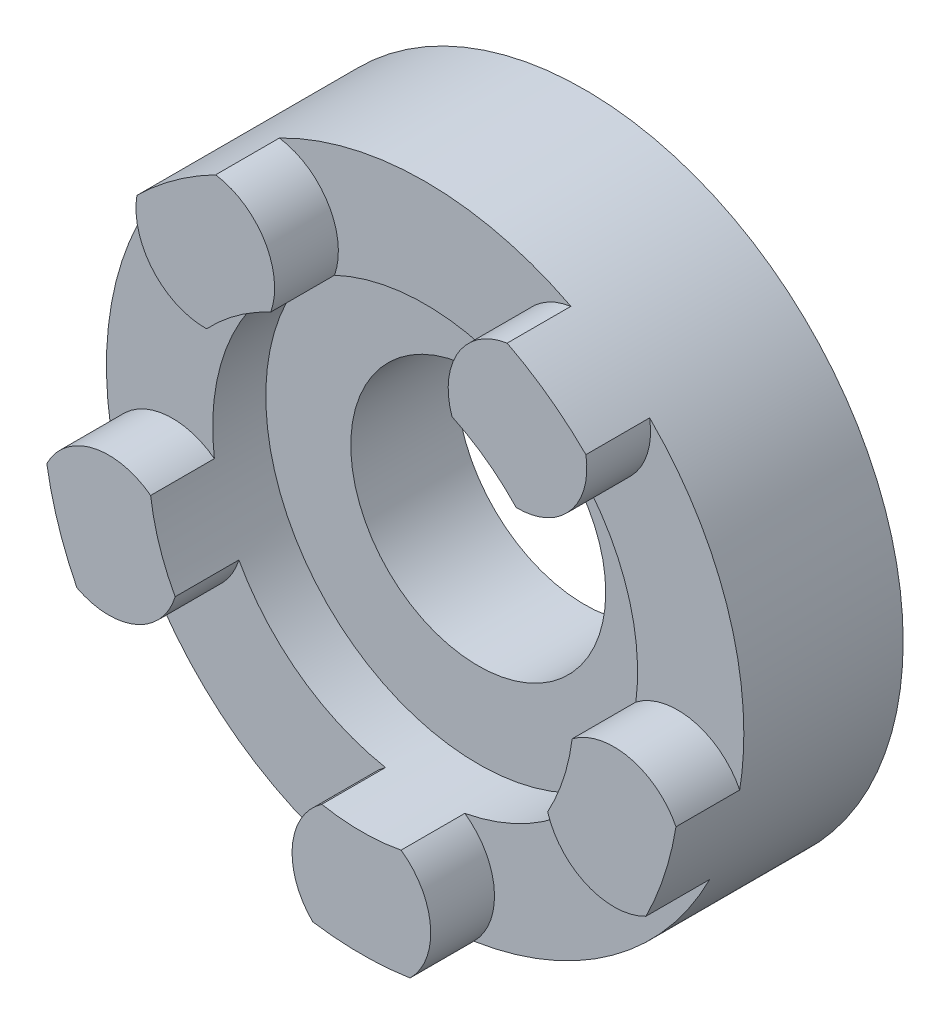
ISO-10303-21;
HEADER;
FILE_DESCRIPTION(('STEP AP214'),'2;1');
FILE_NAME('part.step','',(''),(''),'','','');
FILE_SCHEMA(('AUTOMOTIVE_DESIGN { 1 0 10303 214 1 1 1 1 }'));
ENDSEC;
DATA;
#1=APPLICATION_CONTEXT('core data for automotive mechanical design processes');
#2=APPLICATION_PROTOCOL_DEFINITION('international standard','automotive_design',2000,#1);
#3=PRODUCT_CONTEXT('',#1,'mechanical');
#4=PRODUCT('Part','Part','',(#3));
#5=PRODUCT_RELATED_PRODUCT_CATEGORY('part','',(#4));
#6=PRODUCT_DEFINITION_FORMATION('','',#4);
#7=PRODUCT_DEFINITION_CONTEXT('part definition',#1,'design');
#8=PRODUCT_DEFINITION('design','',#6,#7);
#9=PRODUCT_DEFINITION_SHAPE('','',#8);
#10=(LENGTH_UNIT() NAMED_UNIT(*) SI_UNIT(.MILLI.,.METRE.));
#11=(NAMED_UNIT(*) PLANE_ANGLE_UNIT() SI_UNIT($,.RADIAN.));
#12=(NAMED_UNIT(*) SI_UNIT($,.STERADIAN.) SOLID_ANGLE_UNIT());
#13=UNCERTAINTY_MEASURE_WITH_UNIT(LENGTH_MEASURE(1.E-05),#10,'distance_accuracy_value','');
#14=(GEOMETRIC_REPRESENTATION_CONTEXT(3) GLOBAL_UNCERTAINTY_ASSIGNED_CONTEXT((#13)) GLOBAL_UNIT_ASSIGNED_CONTEXT((#10,
#11,#12)) REPRESENTATION_CONTEXT('',''));
#15=CARTESIAN_POINT('',(0.,0.,0.));
#16=DIRECTION('',(0.,0.,1.));
#17=DIRECTION('',(1.,0.,0.));
#18=AXIS2_PLACEMENT_3D('',#15,#16,#17);
#19=CARTESIAN_POINT('',(0.,0.,2.5));
#20=DIRECTION('',(0.,0.,1.));
#21=DIRECTION('',(1.,0.,0.));
#22=AXIS2_PLACEMENT_3D('',#19,#20,#21);
#23=PLANE('',#22);
#24=CARTESIAN_POINT('',(0.,0.,2.5));
#25=DIRECTION('',(0.,0.,1.));
#26=DIRECTION('',(1.,0.,0.));
#27=AXIS2_PLACEMENT_3D('',#24,#25,#26);
#28=CIRCLE('',#27,15.);
#29=CARTESIAN_POINT('',(2.29060358245761,-14.8240728286133,2.5));
#30=VERTEX_POINT('',#29);
#31=CARTESIAN_POINT('',(13.3906956273311,-6.7593838932388,2.5));
#32=VERTEX_POINT('',#31);
#33=EDGE_CURVE('E312',#30,#32,#28,.T.);
#34=ORIENTED_EDGE('',*,*,#33,.T.);
#35=CARTESIAN_POINT('',(11.8882064536894,-3.86271242968698,2.5));
#36=DIRECTION('',(0.,0.,1.));
#37=DIRECTION('',(1.,0.,0.));
#38=AXIS2_PLACEMENT_3D('',#35,#36,#37);
#39=CIRCLE('',#38,3.26315480550128);
#40=CARTESIAN_POINT('',(8.76615619788801,-4.81191287475464,2.5));
#41=VERTEX_POINT('',#40);
#42=EDGE_CURVE('E188',#41,#32,#39,.T.);
#43=ORIENTED_EDGE('',*,*,#42,.F.);
#44=CARTESIAN_POINT('',(0.,0.,2.5));
#45=DIRECTION('',(0.,0.,1.));
#46=DIRECTION('',(1.,0.,0.));
#47=AXIS2_PLACEMENT_3D('',#44,#45,#46);
#48=CIRCLE('',#47,10.);
#49=CARTESIAN_POINT('',(1.86750985488725,-9.82407282861336,2.5));
#50=VERTEX_POINT('',#49);
#51=EDGE_CURVE('E304',#50,#41,#48,.T.);
#52=ORIENTED_EDGE('',*,*,#51,.F.);
#53=CARTESIAN_POINT('',(0.,-12.5,2.5));
#54=DIRECTION('',(0.,0.,1.));
#55=DIRECTION('',(1.,0.,0.));
#56=AXIS2_PLACEMENT_3D('',#53,#54,#55);
#57=CIRCLE('',#56,3.26315480550132);
#58=EDGE_CURVE('E281',#30,#50,#57,.T.);
#59=ORIENTED_EDGE('',*,*,#58,.F.);
#60=EDGE_LOOP('',(#34,#43,#52,#59));
#61=FACE_BOUND('',#60,.T.);
#62=ADVANCED_FACE('F35',(#61),#23,.T.);
#63=CARTESIAN_POINT('',(9.92034076253372,-1.25969804128286,2.5));
#64=VERTEX_POINT('',#63);
#65=CARTESIAN_POINT('',(7.28529233587261,6.85014712111175,2.5));
#66=VERTEX_POINT('',#65);
#67=EDGE_CURVE('E308',#64,#66,#48,.T.);
#68=ORIENTED_EDGE('',*,*,#67,.F.);
#69=CARTESIAN_POINT('',(11.8882064536894,-3.86271242968698,2.5));
#70=DIRECTION('',(0.,0.,1.));
#71=DIRECTION('',(1.,0.,0.));
#72=AXIS2_PLACEMENT_3D('',#69,#70,#71);
#73=CIRCLE('',#72,3.26315480550132);
#74=CARTESIAN_POINT('',(14.8063664960422,-2.40239696654825,2.5));
#75=VERTEX_POINT('',#74);
#76=EDGE_CURVE('E182',#75,#64,#73,.T.);
#77=ORIENTED_EDGE('',*,*,#76,.F.);
#78=CARTESIAN_POINT('',(10.5665086131529,10.6465438395832,2.5));
#79=VERTEX_POINT('',#78);
#80=EDGE_CURVE('E314',#75,#79,#28,.T.);
#81=ORIENTED_EDGE('',*,*,#80,.T.);
#82=CARTESIAN_POINT('',(7.347315653656,10.1127124296868,2.5));
#83=DIRECTION('',(0.,0.,1.));
#84=DIRECTION('',(1.,0.,0.));
#85=AXIS2_PLACEMENT_3D('',#82,#83,#84);
#86=CIRCLE('',#85,3.26315480550129);
#87=EDGE_CURVE('E192',#66,#79,#86,.T.);
#88=ORIENTED_EDGE('',*,*,#87,.F.);
#89=EDGE_LOOP('',(#68,#77,#81,#88));
#90=FACE_BOUND('',#89,.T.);
#91=ADVANCED_FACE('F346',(#90),#23,.T.);
#92=CARTESIAN_POINT('',(4.26359791633974,9.0455366235389,2.5));
#93=VERTEX_POINT('',#92);
#94=CARTESIAN_POINT('',(-4.26359791633966,9.04553662353894,2.5));
#95=VERTEX_POINT('',#94);
#96=EDGE_CURVE('E366',#93,#95,#48,.T.);
#97=ORIENTED_EDGE('',*,*,#96,.F.);
#98=CARTESIAN_POINT('',(7.347315653656,10.1127124296868,2.5));
#99=DIRECTION('',(0.,0.,1.));
#100=DIRECTION('',(1.,0.,0.));
#101=AXIS2_PLACEMENT_3D('',#98,#99,#100);
#102=CIRCLE('',#101,3.26315480550131);
#103=CARTESIAN_POINT('',(6.86023416198428,13.3393098488169,2.5));
#104=VERTEX_POINT('',#103);
#105=EDGE_CURVE('E211',#104,#93,#102,.T.);
#106=ORIENTED_EDGE('',*,*,#105,.F.);
#107=CARTESIAN_POINT('',(-6.86023416198416,13.339309848817,2.5));
#108=VERTEX_POINT('',#107);
#109=EDGE_CURVE('E379',#104,#108,#28,.T.);
#110=ORIENTED_EDGE('',*,*,#109,.T.);
#111=CARTESIAN_POINT('',(-7.34731565365586,10.1127124296869,2.5));
#112=DIRECTION('',(0.,0.,1.));
#113=DIRECTION('',(1.,0.,0.));
#114=AXIS2_PLACEMENT_3D('',#111,#112,#113);
#115=CIRCLE('',#114,3.26315480550129);
#116=EDGE_CURVE('E229',#95,#108,#115,.T.);
#117=ORIENTED_EDGE('',*,*,#116,.F.);
#118=EDGE_LOOP('',(#97,#106,#110,#117));
#119=FACE_BOUND('',#118,.T.);
#120=ADVANCED_FACE('F351',(#119),#23,.T.);
#121=CARTESIAN_POINT('',(-7.28529233587255,6.85014712111183,2.5));
#122=VERTEX_POINT('',#121);
#123=CARTESIAN_POINT('',(-9.92034076253373,-1.25969804128281,2.5));
#124=VERTEX_POINT('',#123);
#125=EDGE_CURVE('E365',#122,#124,#48,.T.);
#126=ORIENTED_EDGE('',*,*,#125,.F.);
#127=CARTESIAN_POINT('',(-7.34731565365586,10.1127124296869,2.5));
#128=DIRECTION('',(0.,0.,1.));
#129=DIRECTION('',(1.,0.,0.));
#130=AXIS2_PLACEMENT_3D('',#127,#128,#129);
#131=CIRCLE('',#130,3.26315480550131);
#132=CARTESIAN_POINT('',(-10.5665086131528,10.6465438395833,2.5));
#133=VERTEX_POINT('',#132);
#134=EDGE_CURVE('E233',#133,#122,#131,.T.);
#135=ORIENTED_EDGE('',*,*,#134,.F.);
#136=CARTESIAN_POINT('',(-14.8063664960422,-2.40239696654818,2.5));
#137=VERTEX_POINT('',#136);
#138=EDGE_CURVE('E380',#133,#137,#28,.T.);
#139=ORIENTED_EDGE('',*,*,#138,.T.);
#140=CARTESIAN_POINT('',(-11.8882064536894,-3.86271242968685,2.5));
#141=DIRECTION('',(0.,0.,1.));
#142=DIRECTION('',(1.,0.,0.));
#143=AXIS2_PLACEMENT_3D('',#140,#141,#142);
#144=CIRCLE('',#143,3.26315480550128);
#145=EDGE_CURVE('E253',#124,#137,#144,.T.);
#146=ORIENTED_EDGE('',*,*,#145,.F.);
#147=EDGE_LOOP('',(#126,#135,#139,#146));
#148=FACE_BOUND('',#147,.T.);
#149=ADVANCED_FACE('F354',(#148),#23,.T.);
#150=CARTESIAN_POINT('',(-8.76615619788804,-4.81191287475461,2.5));
#151=VERTEX_POINT('',#150);
#152=CARTESIAN_POINT('',(-1.86750985488717,-9.82407282861336,2.5));
#153=VERTEX_POINT('',#152);
#154=EDGE_CURVE('E309',#151,#153,#48,.T.);
#155=ORIENTED_EDGE('',*,*,#154,.F.);
#156=CARTESIAN_POINT('',(-11.8882064536894,-3.86271242968685,2.5));
#157=DIRECTION('',(0.,0.,1.));
#158=DIRECTION('',(1.,0.,0.));
#159=AXIS2_PLACEMENT_3D('',#156,#157,#158);
#160=CIRCLE('',#159,3.26315480550132);
#161=CARTESIAN_POINT('',(-13.3906956273311,-6.75938389323874,2.5));
#162=VERTEX_POINT('',#161);
#163=EDGE_CURVE('E257',#162,#151,#160,.T.);
#164=ORIENTED_EDGE('',*,*,#163,.F.);
#165=CARTESIAN_POINT('',(-2.29060358245752,-14.8240728286134,2.5));
#166=VERTEX_POINT('',#165);
#167=EDGE_CURVE('E307',#162,#166,#28,.T.);
#168=ORIENTED_EDGE('',*,*,#167,.T.);
#169=CARTESIAN_POINT('',(0.,-12.5,2.5));
#170=DIRECTION('',(0.,0.,1.));
#171=DIRECTION('',(1.,0.,0.));
#172=AXIS2_PLACEMENT_3D('',#169,#170,#171);
#173=CIRCLE('',#172,3.26315480550128);
#174=EDGE_CURVE('E277',#153,#166,#173,.T.);
#175=ORIENTED_EDGE('',*,*,#174,.F.);
#176=EDGE_LOOP('',(#155,#164,#168,#175));
#177=FACE_BOUND('',#176,.T.);
#178=ADVANCED_FACE('F326',(#177),#23,.T.);
#179=CARTESIAN_POINT('',(0.,0.,0.));
#180=DIRECTION('',(0.,0.,1.));
#181=DIRECTION('',(1.,0.,0.));
#182=AXIS2_PLACEMENT_3D('',#179,#180,#181);
#183=PLANE('',#182);
#184=CARTESIAN_POINT('',(0.,0.,0.));
#185=DIRECTION('',(0.,0.,1.));
#186=DIRECTION('',(1.,0.,0.));
#187=AXIS2_PLACEMENT_3D('',#184,#185,#186);
#188=CIRCLE('',#187,6.);
#189=CARTESIAN_POINT('',(6.,0.,0.));
#190=VERTEX_POINT('',#189);
#191=EDGE_CURVE('E39',#190,#190,#188,.T.);
#192=ORIENTED_EDGE('',*,*,#191,.F.);
#193=EDGE_LOOP('',(#192));
#194=FACE_BOUND('',#193,.T.);
#195=CARTESIAN_POINT('',(0.,0.,0.));
#196=DIRECTION('',(0.,0.,1.));
#197=DIRECTION('',(1.,0.,0.));
#198=AXIS2_PLACEMENT_3D('',#195,#196,#197);
#199=CIRCLE('',#198,10.);
#200=CARTESIAN_POINT('',(10.,0.,0.));
#201=VERTEX_POINT('',#200);
#202=EDGE_CURVE('E303',#201,#201,#199,.T.);
#203=ORIENTED_EDGE('',*,*,#202,.T.);
#204=EDGE_LOOP('',(#203));
#205=FACE_BOUND('',#204,.T.);
#206=ADVANCED_FACE('F323',(#194,#205),#183,.T.);
#207=CARTESIAN_POINT('',(0.,0.,-5.));
#208=DIRECTION('',(0.,0.,1.));
#209=DIRECTION('',(1.,0.,0.));
#210=AXIS2_PLACEMENT_3D('',#207,#208,#209);
#211=CYLINDRICAL_SURFACE('',#210,15.);
#212=CARTESIAN_POINT('',(0.,0.,-5.));
#213=DIRECTION('',(0.,0.,1.));
#214=DIRECTION('',(1.,0.,0.));
#215=AXIS2_PLACEMENT_3D('',#212,#213,#214);
#216=CIRCLE('',#215,15.);
#217=CARTESIAN_POINT('',(15.,0.,-5.));
#218=VERTEX_POINT('',#217);
#219=EDGE_CURVE('E44',#218,#218,#216,.T.);
#220=ORIENTED_EDGE('',*,*,#219,.T.);
#221=EDGE_LOOP('',(#220));
#222=FACE_BOUND('',#221,.T.);
#223=ORIENTED_EDGE('',*,*,#33,.F.);
#224=DIRECTION('',(0.,0.,-1.));
#225=VECTOR('',#224,1.);
#226=CARTESIAN_POINT('',(2.29060358245762,-14.8240728286133,5.5));
#227=LINE('',#226,#225);
#228=CARTESIAN_POINT('',(2.29060358245762,-14.8240728286133,5.5));
#229=VERTEX_POINT('',#228);
#230=EDGE_CURVE('E297',#229,#30,#227,.T.);
#231=ORIENTED_EDGE('',*,*,#230,.F.);
#232=CARTESIAN_POINT('',(0.,0.,5.5));
#233=DIRECTION('',(0.,0.,1.));
#234=DIRECTION('',(1.,0.,0.));
#235=AXIS2_PLACEMENT_3D('',#232,#233,#234);
#236=CIRCLE('',#235,15.);
#237=CARTESIAN_POINT('',(-2.29060358245749,-14.8240728286134,5.5));
#238=VERTEX_POINT('',#237);
#239=EDGE_CURVE('E280',#238,#229,#236,.T.);
#240=ORIENTED_EDGE('',*,*,#239,.F.);
#241=DIRECTION('',(0.,0.,-1.));
#242=VECTOR('',#241,1.);
#243=CARTESIAN_POINT('',(-2.29060358245749,-14.8240728286134,5.5));
#244=LINE('',#243,#242);
#245=EDGE_CURVE('E300',#238,#166,#244,.T.);
#246=ORIENTED_EDGE('',*,*,#245,.T.);
#247=ORIENTED_EDGE('',*,*,#167,.F.);
#248=DIRECTION('',(0.,0.,-1.));
#249=VECTOR('',#248,1.);
#250=CARTESIAN_POINT('',(-13.3906956273311,-6.75938389323874,5.5));
#251=LINE('',#250,#249);
#252=CARTESIAN_POINT('',(-13.3906956273311,-6.75938389323874,5.5));
#253=VERTEX_POINT('',#252);
#254=EDGE_CURVE('E272',#253,#162,#251,.T.);
#255=ORIENTED_EDGE('',*,*,#254,.F.);
#256=CARTESIAN_POINT('',(0.,0.,5.5));
#257=DIRECTION('',(0.,0.,1.));
#258=DIRECTION('',(1.,0.,0.));
#259=AXIS2_PLACEMENT_3D('',#256,#257,#258);
#260=CIRCLE('',#259,15.);
#261=CARTESIAN_POINT('',(-14.8063664960422,-2.40239696654818,5.5));
#262=VERTEX_POINT('',#261);
#263=EDGE_CURVE('E256',#262,#253,#260,.T.);
#264=ORIENTED_EDGE('',*,*,#263,.F.);
#265=DIRECTION('',(0.,0.,-1.));
#266=VECTOR('',#265,1.);
#267=CARTESIAN_POINT('',(-14.8063664960422,-2.40239696654818,5.5));
#268=LINE('',#267,#266);
#269=EDGE_CURVE('E274',#262,#137,#268,.T.);
#270=ORIENTED_EDGE('',*,*,#269,.T.);
#271=ORIENTED_EDGE('',*,*,#138,.F.);
#272=DIRECTION('',(0.,0.,-1.));
#273=VECTOR('',#272,1.);
#274=CARTESIAN_POINT('',(-10.5665086131528,10.6465438395833,5.5));
#275=LINE('',#274,#273);
#276=CARTESIAN_POINT('',(-10.5665086131528,10.6465438395833,5.5));
#277=VERTEX_POINT('',#276);
#278=EDGE_CURVE('E248',#277,#133,#275,.T.);
#279=ORIENTED_EDGE('',*,*,#278,.F.);
#280=CARTESIAN_POINT('',(0.,0.,5.5));
#281=DIRECTION('',(0.,0.,1.));
#282=DIRECTION('',(1.,0.,0.));
#283=AXIS2_PLACEMENT_3D('',#280,#281,#282);
#284=CIRCLE('',#283,15.);
#285=CARTESIAN_POINT('',(-6.86023416198416,13.339309848817,5.5));
#286=VERTEX_POINT('',#285);
#287=EDGE_CURVE('E232',#286,#277,#284,.T.);
#288=ORIENTED_EDGE('',*,*,#287,.F.);
#289=DIRECTION('',(0.,0.,-1.));
#290=VECTOR('',#289,1.);
#291=CARTESIAN_POINT('',(-6.86023416198416,13.339309848817,5.5));
#292=LINE('',#291,#290);
#293=EDGE_CURVE('E250',#286,#108,#292,.T.);
#294=ORIENTED_EDGE('',*,*,#293,.T.);
#295=ORIENTED_EDGE('',*,*,#109,.F.);
#296=DIRECTION('',(0.,0.,-1.));
#297=VECTOR('',#296,1.);
#298=CARTESIAN_POINT('',(6.86023416198428,13.3393098488169,5.5));
#299=LINE('',#298,#297);
#300=CARTESIAN_POINT('',(6.86023416198428,13.3393098488169,5.5));
#301=VERTEX_POINT('',#300);
#302=EDGE_CURVE('E224',#301,#104,#299,.T.);
#303=ORIENTED_EDGE('',*,*,#302,.F.);
#304=CARTESIAN_POINT('',(0.,0.,5.5));
#305=DIRECTION('',(0.,0.,1.));
#306=DIRECTION('',(1.,0.,0.));
#307=AXIS2_PLACEMENT_3D('',#304,#305,#306);
#308=CIRCLE('',#307,15.);
#309=CARTESIAN_POINT('',(10.5665086131529,10.6465438395832,5.5));
#310=VERTEX_POINT('',#309);
#311=EDGE_CURVE('E210',#310,#301,#308,.T.);
#312=ORIENTED_EDGE('',*,*,#311,.F.);
#313=DIRECTION('',(0.,0.,-1.));
#314=VECTOR('',#313,1.);
#315=CARTESIAN_POINT('',(10.5665086131529,10.6465438395832,5.5));
#316=LINE('',#315,#314);
#317=EDGE_CURVE('E226',#310,#79,#316,.T.);
#318=ORIENTED_EDGE('',*,*,#317,.T.);
#319=ORIENTED_EDGE('',*,*,#80,.F.);
#320=DIRECTION('',(0.,0.,-1.));
#321=VECTOR('',#320,1.);
#322=CARTESIAN_POINT('',(14.8063664960422,-2.40239696654825,5.5));
#323=LINE('',#322,#321);
#324=CARTESIAN_POINT('',(14.8063664960422,-2.40239696654825,5.5));
#325=VERTEX_POINT('',#324);
#326=EDGE_CURVE('E193',#325,#75,#323,.T.);
#327=ORIENTED_EDGE('',*,*,#326,.F.);
#328=CARTESIAN_POINT('',(0.,0.,5.5));
#329=DIRECTION('',(0.,0.,1.));
#330=DIRECTION('',(1.,0.,0.));
#331=AXIS2_PLACEMENT_3D('',#328,#329,#330);
#332=CIRCLE('',#331,15.);
#333=CARTESIAN_POINT('',(13.3906956273311,-6.7593838932388,5.5));
#334=VERTEX_POINT('',#333);
#335=EDGE_CURVE('E177',#334,#325,#332,.T.);
#336=ORIENTED_EDGE('',*,*,#335,.F.);
#337=DIRECTION('',(0.,0.,-1.));
#338=VECTOR('',#337,1.);
#339=CARTESIAN_POINT('',(13.3906956273311,-6.7593838932388,5.5));
#340=LINE('',#339,#338);
#341=EDGE_CURVE('E185',#334,#32,#340,.T.);
#342=ORIENTED_EDGE('',*,*,#341,.T.);
#343=EDGE_LOOP('',(#223,#231,#240,#246,#247,#255,#264,#270,#271,#279,#288,#294,#295,#303,#312,
#318,#319,#327,#336,#342));
#344=FACE_BOUND('',#343,.T.);
#345=ADVANCED_FACE('F37',(#222,#344),#211,.T.);
#346=CARTESIAN_POINT('',(0.,0.,-5.));
#347=DIRECTION('',(0.,0.,1.));
#348=DIRECTION('',(1.,0.,0.));
#349=AXIS2_PLACEMENT_3D('',#346,#347,#348);
#350=CYLINDRICAL_SURFACE('',#349,6.);
#351=CARTESIAN_POINT('',(0.,0.,-5.));
#352=DIRECTION('',(0.,0.,1.));
#353=DIRECTION('',(1.,0.,0.));
#354=AXIS2_PLACEMENT_3D('',#351,#352,#353);
#355=CIRCLE('',#354,6.);
#356=CARTESIAN_POINT('',(6.,0.,-5.));
#357=VERTEX_POINT('',#356);
#358=EDGE_CURVE('E11',#357,#357,#355,.T.);
#359=ORIENTED_EDGE('',*,*,#358,.F.);
#360=EDGE_LOOP('',(#359));
#361=FACE_BOUND('',#360,.T.);
#362=ORIENTED_EDGE('',*,*,#191,.T.);
#363=EDGE_LOOP('',(#362));
#364=FACE_BOUND('',#363,.T.);
#365=ADVANCED_FACE('F321',(#361,#364),#350,.F.);
#366=CARTESIAN_POINT('',(0.,0.,-5.));
#367=DIRECTION('',(0.,0.,1.));
#368=DIRECTION('',(1.,0.,0.));
#369=AXIS2_PLACEMENT_3D('',#366,#367,#368);
#370=PLANE('',#369);
#371=ORIENTED_EDGE('',*,*,#219,.F.);
#372=EDGE_LOOP('',(#371));
#373=FACE_BOUND('',#372,.T.);
#374=ORIENTED_EDGE('',*,*,#358,.T.);
#375=EDGE_LOOP('',(#374));
#376=FACE_BOUND('',#375,.T.);
#377=ADVANCED_FACE('F333',(#373,#376),#370,.F.);
#378=CARTESIAN_POINT('',(0.,0.,2.5));
#379=DIRECTION('',(0.,0.,-1.));
#380=DIRECTION('',(-1.,0.,0.));
#381=AXIS2_PLACEMENT_3D('',#378,#379,#380);
#382=CYLINDRICAL_SURFACE('',#381,10.);
#383=ORIENTED_EDGE('',*,*,#51,.T.);
#384=DIRECTION('',(0.,0.,-1.));
#385=VECTOR('',#384,1.);
#386=CARTESIAN_POINT('',(8.76615619788801,-4.81191287475464,5.5));
#387=LINE('',#386,#385);
#388=CARTESIAN_POINT('',(8.76615619788801,-4.81191287475464,5.5));
#389=VERTEX_POINT('',#388);
#390=EDGE_CURVE('E202',#389,#41,#387,.T.);
#391=ORIENTED_EDGE('',*,*,#390,.F.);
#392=CARTESIAN_POINT('',(0.,0.,5.5));
#393=DIRECTION('',(0.,0.,-1.));
#394=DIRECTION('',(1.,0.,0.));
#395=AXIS2_PLACEMENT_3D('',#392,#393,#394);
#396=CIRCLE('',#395,9.99999999999999);
#397=CARTESIAN_POINT('',(9.92034076253373,-1.25969804128286,5.5));
#398=VERTEX_POINT('',#397);
#399=EDGE_CURVE('E179',#398,#389,#396,.T.);
#400=ORIENTED_EDGE('',*,*,#399,.F.);
#401=DIRECTION('',(0.,0.,-1.));
#402=VECTOR('',#401,1.);
#403=CARTESIAN_POINT('',(9.92034076253373,-1.25969804128286,5.5));
#404=LINE('',#403,#402);
#405=EDGE_CURVE('E51',#398,#64,#404,.T.);
#406=ORIENTED_EDGE('',*,*,#405,.T.);
#407=ORIENTED_EDGE('',*,*,#67,.T.);
#408=DIRECTION('',(0.,0.,-1.));
#409=VECTOR('',#408,1.);
#410=CARTESIAN_POINT('',(7.28529233587261,6.85014712111175,5.5));
#411=LINE('',#410,#409);
#412=CARTESIAN_POINT('',(7.28529233587261,6.85014712111175,5.5));
#413=VERTEX_POINT('',#412);
#414=EDGE_CURVE('E217',#413,#66,#411,.T.);
#415=ORIENTED_EDGE('',*,*,#414,.F.);
#416=CARTESIAN_POINT('',(0.,0.,5.5));
#417=DIRECTION('',(0.,0.,-1.));
#418=DIRECTION('',(1.,0.,0.));
#419=AXIS2_PLACEMENT_3D('',#416,#417,#418);
#420=CIRCLE('',#419,9.99999999999999);
#421=CARTESIAN_POINT('',(4.26359791633974,9.0455366235389,5.5));
#422=VERTEX_POINT('',#421);
#423=EDGE_CURVE('E215',#422,#413,#420,.T.);
#424=ORIENTED_EDGE('',*,*,#423,.F.);
#425=DIRECTION('',(0.,0.,-1.));
#426=VECTOR('',#425,1.);
#427=CARTESIAN_POINT('',(4.26359791633974,9.0455366235389,5.5));
#428=LINE('',#427,#426);
#429=EDGE_CURVE('E58',#422,#93,#428,.T.);
#430=ORIENTED_EDGE('',*,*,#429,.T.);
#431=ORIENTED_EDGE('',*,*,#96,.T.);
#432=DIRECTION('',(0.,0.,-1.));
#433=VECTOR('',#432,1.);
#434=CARTESIAN_POINT('',(-4.26359791633966,9.04553662353894,5.5));
#435=LINE('',#434,#433);
#436=CARTESIAN_POINT('',(-4.26359791633966,9.04553662353894,5.5));
#437=VERTEX_POINT('',#436);
#438=EDGE_CURVE('E239',#437,#95,#435,.T.);
#439=ORIENTED_EDGE('',*,*,#438,.F.);
#440=CARTESIAN_POINT('',(0.,0.,5.5));
#441=DIRECTION('',(0.,0.,-1.));
#442=DIRECTION('',(1.,0.,0.));
#443=AXIS2_PLACEMENT_3D('',#440,#441,#442);
#444=CIRCLE('',#443,10.);
#445=CARTESIAN_POINT('',(-7.28529233587256,6.85014712111183,5.5));
#446=VERTEX_POINT('',#445);
#447=EDGE_CURVE('E237',#446,#437,#444,.T.);
#448=ORIENTED_EDGE('',*,*,#447,.F.);
#449=DIRECTION('',(0.,0.,-1.));
#450=VECTOR('',#449,1.);
#451=CARTESIAN_POINT('',(-7.28529233587256,6.85014712111183,5.5));
#452=LINE('',#451,#450);
#453=EDGE_CURVE('E246',#446,#122,#452,.T.);
#454=ORIENTED_EDGE('',*,*,#453,.T.);
#455=ORIENTED_EDGE('',*,*,#125,.T.);
#456=DIRECTION('',(0.,0.,-1.));
#457=VECTOR('',#456,1.);
#458=CARTESIAN_POINT('',(-9.92034076253373,-1.25969804128281,5.5));
#459=LINE('',#458,#457);
#460=CARTESIAN_POINT('',(-9.92034076253373,-1.25969804128281,5.5));
#461=VERTEX_POINT('',#460);
#462=EDGE_CURVE('E263',#461,#124,#459,.T.);
#463=ORIENTED_EDGE('',*,*,#462,.F.);
#464=CARTESIAN_POINT('',(0.,0.,5.5));
#465=DIRECTION('',(0.,0.,-1.));
#466=DIRECTION('',(1.,0.,0.));
#467=AXIS2_PLACEMENT_3D('',#464,#465,#466);
#468=CIRCLE('',#467,10.);
#469=CARTESIAN_POINT('',(-8.76615619788804,-4.81191287475461,5.5));
#470=VERTEX_POINT('',#469);
#471=EDGE_CURVE('E261',#470,#461,#468,.T.);
#472=ORIENTED_EDGE('',*,*,#471,.F.);
#473=DIRECTION('',(0.,0.,-1.));
#474=VECTOR('',#473,1.);
#475=CARTESIAN_POINT('',(-8.76615619788804,-4.81191287475461,5.5));
#476=LINE('',#475,#474);
#477=EDGE_CURVE('E270',#470,#151,#476,.T.);
#478=ORIENTED_EDGE('',*,*,#477,.T.);
#479=ORIENTED_EDGE('',*,*,#154,.T.);
#480=DIRECTION('',(0.,0.,-1.));
#481=VECTOR('',#480,1.);
#482=CARTESIAN_POINT('',(-1.86750985488717,-9.82407282861337,5.5));
#483=LINE('',#482,#481);
#484=CARTESIAN_POINT('',(-1.86750985488717,-9.82407282861337,5.5));
#485=VERTEX_POINT('',#484);
#486=EDGE_CURVE('E287',#485,#153,#483,.T.);
#487=ORIENTED_EDGE('',*,*,#486,.F.);
#488=CARTESIAN_POINT('',(0.,0.,5.5));
#489=DIRECTION('',(0.,0.,-1.));
#490=DIRECTION('',(1.,0.,0.));
#491=AXIS2_PLACEMENT_3D('',#488,#489,#490);
#492=CIRCLE('',#491,10.);
#493=CARTESIAN_POINT('',(1.86750985488725,-9.82407282861336,5.5));
#494=VERTEX_POINT('',#493);
#495=EDGE_CURVE('E285',#494,#485,#492,.T.);
#496=ORIENTED_EDGE('',*,*,#495,.F.);
#497=DIRECTION('',(0.,0.,-1.));
#498=VECTOR('',#497,1.);
#499=CARTESIAN_POINT('',(1.86750985488725,-9.82407282861336,5.5));
#500=LINE('',#499,#498);
#501=EDGE_CURVE('E294',#494,#50,#500,.T.);
#502=ORIENTED_EDGE('',*,*,#501,.T.);
#503=EDGE_LOOP('',(#383,#391,#400,#406,#407,#415,#424,#430,#431,#439,#448,#454,#455,#463,#472,
#478,#479,#487,#496,#502));
#504=FACE_BOUND('',#503,.T.);
#505=ORIENTED_EDGE('',*,*,#202,.F.);
#506=EDGE_LOOP('',(#505));
#507=FACE_BOUND('',#506,.T.);
#508=ADVANCED_FACE('F330',(#504,#507),#382,.F.);
#509=CARTESIAN_POINT('',(0.,-12.5,5.5));
#510=DIRECTION('',(0.,0.,-1.));
#511=DIRECTION('',(-1.,0.,0.));
#512=AXIS2_PLACEMENT_3D('',#509,#510,#511);
#513=CYLINDRICAL_SURFACE('',#512,3.26315480550128);
#514=ORIENTED_EDGE('',*,*,#174,.T.);
#515=ORIENTED_EDGE('',*,*,#245,.F.);
#516=CARTESIAN_POINT('',(0.,-12.5,5.5));
#517=DIRECTION('',(0.,0.,1.));
#518=DIRECTION('',(-1.,0.,0.));
#519=AXIS2_PLACEMENT_3D('',#516,#517,#518);
#520=CIRCLE('',#519,3.26315480550128);
#521=EDGE_CURVE('E278',#485,#238,#520,.T.);
#522=ORIENTED_EDGE('',*,*,#521,.F.);
#523=ORIENTED_EDGE('',*,*,#486,.T.);
#524=EDGE_LOOP('',(#514,#515,#522,#523));
#525=FACE_BOUND('',#524,.T.);
#526=ADVANCED_FACE('F332',(#525),#513,.T.);
#527=CARTESIAN_POINT('',(0.,-12.5,5.5));
#528=DIRECTION('',(0.,0.,-1.));
#529=DIRECTION('',(-1.,0.,0.));
#530=AXIS2_PLACEMENT_3D('',#527,#528,#529);
#531=CYLINDRICAL_SURFACE('',#530,3.26315480550132);
#532=ORIENTED_EDGE('',*,*,#58,.T.);
#533=ORIENTED_EDGE('',*,*,#501,.F.);
#534=CARTESIAN_POINT('',(0.,-12.5,5.5));
#535=DIRECTION('',(0.,0.,1.));
#536=DIRECTION('',(-1.,0.,0.));
#537=AXIS2_PLACEMENT_3D('',#534,#535,#536);
#538=CIRCLE('',#537,3.26315480550132);
#539=EDGE_CURVE('E283',#229,#494,#538,.T.);
#540=ORIENTED_EDGE('',*,*,#539,.F.);
#541=ORIENTED_EDGE('',*,*,#230,.T.);
#542=EDGE_LOOP('',(#532,#533,#540,#541));
#543=FACE_BOUND('',#542,.T.);
#544=ADVANCED_FACE('F339',(#543),#531,.T.);
#545=CARTESIAN_POINT('',(0.,-6.25,5.5));
#546=DIRECTION('',(0.,0.,-1.));
#547=DIRECTION('',(-1.,0.,0.));
#548=AXIS2_PLACEMENT_3D('',#545,#546,#547);
#549=PLANE('',#548);
#550=ORIENTED_EDGE('',*,*,#521,.T.);
#551=ORIENTED_EDGE('',*,*,#239,.T.);
#552=ORIENTED_EDGE('',*,*,#539,.T.);
#553=ORIENTED_EDGE('',*,*,#495,.T.);
#554=EDGE_LOOP('',(#550,#551,#552,#553));
#555=FACE_BOUND('',#554,.T.);
#556=ADVANCED_FACE('F395',(#555),#549,.F.);
#557=CARTESIAN_POINT('',(-11.8882064536894,-3.86271242968685,5.5));
#558=DIRECTION('',(0.,0.,-1.));
#559=DIRECTION('',(-1.,0.,0.));
#560=AXIS2_PLACEMENT_3D('',#557,#558,#559);
#561=CYLINDRICAL_SURFACE('',#560,3.26315480550128);
#562=ORIENTED_EDGE('',*,*,#145,.T.);
#563=ORIENTED_EDGE('',*,*,#269,.F.);
#564=CARTESIAN_POINT('',(-11.8882064536894,-3.86271242968685,5.5));
#565=DIRECTION('',(0.,0.,1.));
#566=DIRECTION('',(-1.,0.,0.));
#567=AXIS2_PLACEMENT_3D('',#564,#565,#566);
#568=CIRCLE('',#567,3.26315480550128);
#569=EDGE_CURVE('E254',#461,#262,#568,.T.);
#570=ORIENTED_EDGE('',*,*,#569,.F.);
#571=ORIENTED_EDGE('',*,*,#462,.T.);
#572=EDGE_LOOP('',(#562,#563,#570,#571));
#573=FACE_BOUND('',#572,.T.);
#574=ADVANCED_FACE('F404',(#573),#561,.T.);
#575=CARTESIAN_POINT('',(-11.8882064536894,-3.86271242968685,5.5));
#576=DIRECTION('',(0.,0.,-1.));
#577=DIRECTION('',(-1.,0.,0.));
#578=AXIS2_PLACEMENT_3D('',#575,#576,#577);
#579=CYLINDRICAL_SURFACE('',#578,3.26315480550132);
#580=ORIENTED_EDGE('',*,*,#163,.T.);
#581=ORIENTED_EDGE('',*,*,#477,.F.);
#582=CARTESIAN_POINT('',(-11.8882064536894,-3.86271242968685,5.5));
#583=DIRECTION('',(0.,0.,1.));
#584=DIRECTION('',(-1.,0.,0.));
#585=AXIS2_PLACEMENT_3D('',#582,#583,#584);
#586=CIRCLE('',#585,3.26315480550132);
#587=EDGE_CURVE('E259',#253,#470,#586,.T.);
#588=ORIENTED_EDGE('',*,*,#587,.F.);
#589=ORIENTED_EDGE('',*,*,#254,.T.);
#590=EDGE_LOOP('',(#580,#581,#588,#589));
#591=FACE_BOUND('',#590,.T.);
#592=ADVANCED_FACE('F409',(#591),#579,.T.);
#593=CARTESIAN_POINT('',(-5.94410322684471,-1.93135621484342,5.5));
#594=DIRECTION('',(0.,0.,-1.));
#595=DIRECTION('',(-1.,0.,0.));
#596=AXIS2_PLACEMENT_3D('',#593,#594,#595);
#597=PLANE('',#596);
#598=ORIENTED_EDGE('',*,*,#569,.T.);
#599=ORIENTED_EDGE('',*,*,#263,.T.);
#600=ORIENTED_EDGE('',*,*,#587,.T.);
#601=ORIENTED_EDGE('',*,*,#471,.T.);
#602=EDGE_LOOP('',(#598,#599,#600,#601));
#603=FACE_BOUND('',#602,.T.);
#604=ADVANCED_FACE('F413',(#603),#597,.F.);
#605=CARTESIAN_POINT('',(-7.34731565365586,10.1127124296869,5.5));
#606=DIRECTION('',(0.,0.,-1.));
#607=DIRECTION('',(-1.,0.,0.));
#608=AXIS2_PLACEMENT_3D('',#605,#606,#607);
#609=CYLINDRICAL_SURFACE('',#608,3.26315480550129);
#610=ORIENTED_EDGE('',*,*,#116,.T.);
#611=ORIENTED_EDGE('',*,*,#293,.F.);
#612=CARTESIAN_POINT('',(-7.34731565365586,10.1127124296869,5.5));
#613=DIRECTION('',(0.,0.,1.));
#614=DIRECTION('',(-1.,0.,0.));
#615=AXIS2_PLACEMENT_3D('',#612,#613,#614);
#616=CIRCLE('',#615,3.26315480550129);
#617=EDGE_CURVE('E230',#437,#286,#616,.T.);
#618=ORIENTED_EDGE('',*,*,#617,.F.);
#619=ORIENTED_EDGE('',*,*,#438,.T.);
#620=EDGE_LOOP('',(#610,#611,#618,#619));
#621=FACE_BOUND('',#620,.T.);
#622=ADVANCED_FACE('F417',(#621),#609,.T.);
#623=CARTESIAN_POINT('',(-7.34731565365586,10.1127124296869,5.5));
#624=DIRECTION('',(0.,0.,-1.));
#625=DIRECTION('',(-1.,0.,0.));
#626=AXIS2_PLACEMENT_3D('',#623,#624,#625);
#627=CYLINDRICAL_SURFACE('',#626,3.26315480550131);
#628=ORIENTED_EDGE('',*,*,#134,.T.);
#629=ORIENTED_EDGE('',*,*,#453,.F.);
#630=CARTESIAN_POINT('',(-7.34731565365586,10.1127124296869,5.5));
#631=DIRECTION('',(0.,0.,1.));
#632=DIRECTION('',(-1.,0.,0.));
#633=AXIS2_PLACEMENT_3D('',#630,#631,#632);
#634=CIRCLE('',#633,3.26315480550131);
#635=EDGE_CURVE('E235',#277,#446,#634,.T.);
#636=ORIENTED_EDGE('',*,*,#635,.F.);
#637=ORIENTED_EDGE('',*,*,#278,.T.);
#638=EDGE_LOOP('',(#628,#629,#636,#637));
#639=FACE_BOUND('',#638,.T.);
#640=ADVANCED_FACE('F421',(#639),#627,.T.);
#641=CARTESIAN_POINT('',(-3.67365782682793,5.05635621484344,5.5));
#642=DIRECTION('',(0.,0.,-1.));
#643=DIRECTION('',(-1.,0.,0.));
#644=AXIS2_PLACEMENT_3D('',#641,#642,#643);
#645=PLANE('',#644);
#646=ORIENTED_EDGE('',*,*,#617,.T.);
#647=ORIENTED_EDGE('',*,*,#287,.T.);
#648=ORIENTED_EDGE('',*,*,#635,.T.);
#649=ORIENTED_EDGE('',*,*,#447,.T.);
#650=EDGE_LOOP('',(#646,#647,#648,#649));
#651=FACE_BOUND('',#650,.T.);
#652=ADVANCED_FACE('F425',(#651),#645,.F.);
#653=CARTESIAN_POINT('',(7.347315653656,10.1127124296868,5.5));
#654=DIRECTION('',(0.,0.,-1.));
#655=DIRECTION('',(-1.,0.,0.));
#656=AXIS2_PLACEMENT_3D('',#653,#654,#655);
#657=CYLINDRICAL_SURFACE('',#656,3.26315480550129);
#658=ORIENTED_EDGE('',*,*,#87,.T.);
#659=ORIENTED_EDGE('',*,*,#317,.F.);
#660=CARTESIAN_POINT('',(7.347315653656,10.1127124296868,5.5));
#661=DIRECTION('',(0.,0.,1.));
#662=DIRECTION('',(-1.,0.,0.));
#663=AXIS2_PLACEMENT_3D('',#660,#661,#662);
#664=CIRCLE('',#663,3.26315480550129);
#665=EDGE_CURVE('E208',#413,#310,#664,.T.);
#666=ORIENTED_EDGE('',*,*,#665,.F.);
#667=ORIENTED_EDGE('',*,*,#414,.T.);
#668=EDGE_LOOP('',(#658,#659,#666,#667));
#669=FACE_BOUND('',#668,.T.);
#670=ADVANCED_FACE('F377',(#669),#657,.T.);
#671=CARTESIAN_POINT('',(7.347315653656,10.1127124296868,5.5));
#672=DIRECTION('',(0.,0.,-1.));
#673=DIRECTION('',(-1.,0.,0.));
#674=AXIS2_PLACEMENT_3D('',#671,#672,#673);
#675=CYLINDRICAL_SURFACE('',#674,3.26315480550131);
#676=ORIENTED_EDGE('',*,*,#105,.T.);
#677=ORIENTED_EDGE('',*,*,#429,.F.);
#678=CARTESIAN_POINT('',(7.347315653656,10.1127124296868,5.5));
#679=DIRECTION('',(0.,0.,1.));
#680=DIRECTION('',(-1.,0.,0.));
#681=AXIS2_PLACEMENT_3D('',#678,#679,#680);
#682=CIRCLE('',#681,3.26315480550131);
#683=EDGE_CURVE('E213',#301,#422,#682,.T.);
#684=ORIENTED_EDGE('',*,*,#683,.F.);
#685=ORIENTED_EDGE('',*,*,#302,.T.);
#686=EDGE_LOOP('',(#676,#677,#684,#685));
#687=FACE_BOUND('',#686,.T.);
#688=ADVANCED_FACE('F432',(#687),#675,.T.);
#689=CARTESIAN_POINT('',(3.673657826828,5.05635621484339,5.5));
#690=DIRECTION('',(0.,0.,-1.));
#691=DIRECTION('',(-1.,0.,0.));
#692=AXIS2_PLACEMENT_3D('',#689,#690,#691);
#693=PLANE('',#692);
#694=ORIENTED_EDGE('',*,*,#665,.T.);
#695=ORIENTED_EDGE('',*,*,#311,.T.);
#696=ORIENTED_EDGE('',*,*,#683,.T.);
#697=ORIENTED_EDGE('',*,*,#423,.T.);
#698=EDGE_LOOP('',(#694,#695,#696,#697));
#699=FACE_BOUND('',#698,.T.);
#700=ADVANCED_FACE('F435',(#699),#693,.F.);
#701=CARTESIAN_POINT('',(11.8882064536894,-3.86271242968698,5.5));
#702=DIRECTION('',(0.,0.,-1.));
#703=DIRECTION('',(-1.,0.,0.));
#704=AXIS2_PLACEMENT_3D('',#701,#702,#703);
#705=CYLINDRICAL_SURFACE('',#704,3.26315480550128);
#706=ORIENTED_EDGE('',*,*,#42,.T.);
#707=ORIENTED_EDGE('',*,*,#341,.F.);
#708=CARTESIAN_POINT('',(11.8882064536894,-3.86271242968698,5.5));
#709=DIRECTION('',(0.,0.,1.));
#710=DIRECTION('',(-1.,0.,0.));
#711=AXIS2_PLACEMENT_3D('',#708,#709,#710);
#712=CIRCLE('',#711,3.26315480550128);
#713=EDGE_CURVE('E173',#389,#334,#712,.T.);
#714=ORIENTED_EDGE('',*,*,#713,.F.);
#715=ORIENTED_EDGE('',*,*,#390,.T.);
#716=EDGE_LOOP('',(#706,#707,#714,#715));
#717=FACE_BOUND('',#716,.T.);
#718=ADVANCED_FACE('F186',(#717),#705,.T.);
#719=CARTESIAN_POINT('',(11.8882064536894,-3.86271242968698,5.5));
#720=DIRECTION('',(0.,0.,-1.));
#721=DIRECTION('',(-1.,0.,0.));
#722=AXIS2_PLACEMENT_3D('',#719,#720,#721);
#723=CYLINDRICAL_SURFACE('',#722,3.26315480550132);
#724=ORIENTED_EDGE('',*,*,#76,.T.);
#725=ORIENTED_EDGE('',*,*,#405,.F.);
#726=CARTESIAN_POINT('',(11.8882064536894,-3.86271242968698,5.5));
#727=DIRECTION('',(0.,0.,1.));
#728=DIRECTION('',(-1.,0.,0.));
#729=AXIS2_PLACEMENT_3D('',#726,#727,#728);
#730=CIRCLE('',#729,3.26315480550132);
#731=EDGE_CURVE('E197',#325,#398,#730,.T.);
#732=ORIENTED_EDGE('',*,*,#731,.F.);
#733=ORIENTED_EDGE('',*,*,#326,.T.);
#734=EDGE_LOOP('',(#724,#725,#732,#733));
#735=FACE_BOUND('',#734,.T.);
#736=ADVANCED_FACE('F442',(#735),#723,.T.);
#737=CARTESIAN_POINT('',(5.94410322684469,-1.93135621484349,5.5));
#738=DIRECTION('',(0.,0.,-1.));
#739=DIRECTION('',(-1.,0.,0.));
#740=AXIS2_PLACEMENT_3D('',#737,#738,#739);
#741=PLANE('',#740);
#742=ORIENTED_EDGE('',*,*,#713,.T.);
#743=ORIENTED_EDGE('',*,*,#335,.T.);
#744=ORIENTED_EDGE('',*,*,#731,.T.);
#745=ORIENTED_EDGE('',*,*,#399,.T.);
#746=EDGE_LOOP('',(#742,#743,#744,#745));
#747=FACE_BOUND('',#746,.T.);
#748=ADVANCED_FACE('F175',(#747),#741,.F.);
#749=CLOSED_SHELL('',(#62,#91,#120,#149,#178,#206,#345,#365,#377,#508,#526,#544,#556,#574,#592,
#604,#622,#640,#652,#670,#688,#700,#718,#736,#748));
#750=MANIFOLD_SOLID_BREP('B2',#749);
#751=ADVANCED_BREP_SHAPE_REPRESENTATION('',(#18,#750),#14);
#752=SHAPE_DEFINITION_REPRESENTATION(#9,#751);
ENDSEC;
END-ISO-10303-21;
